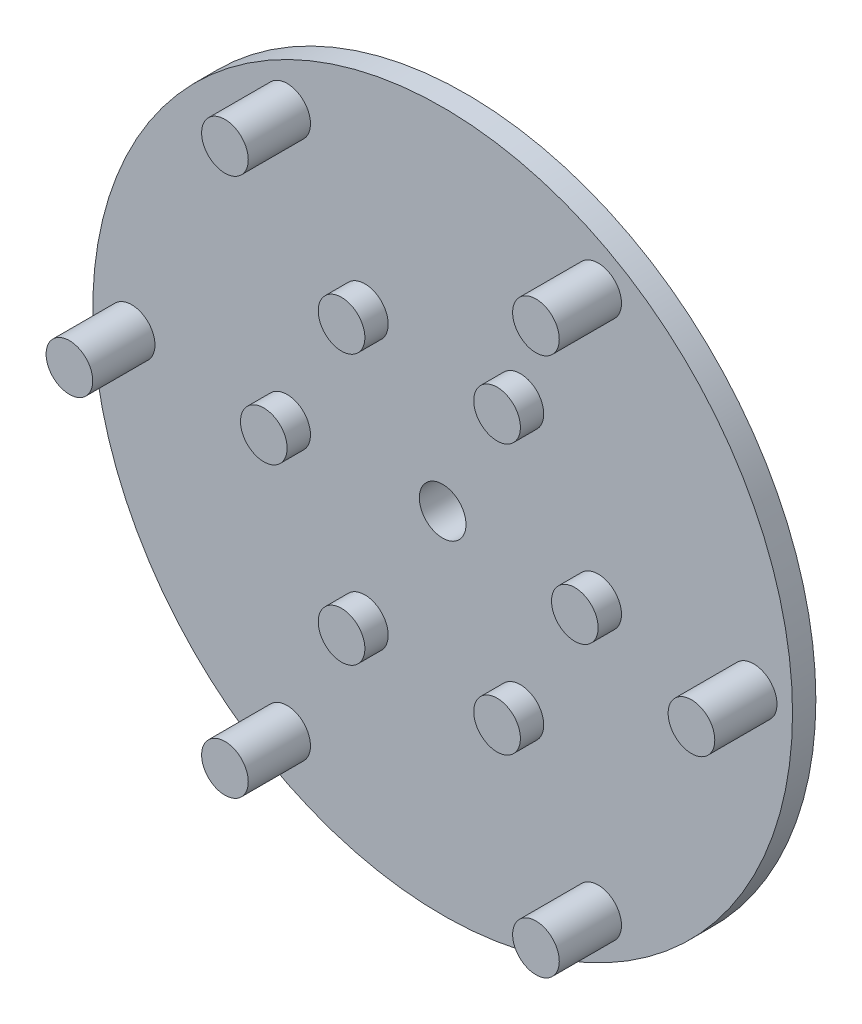
ISO-10303-21;
HEADER;
FILE_DESCRIPTION(('STEP AP214'),'2;1');
FILE_NAME('part.step','',(''),(''),'','','');
FILE_SCHEMA(('AUTOMOTIVE_DESIGN { 1 0 10303 214 1 1 1 1 }'));
ENDSEC;
DATA;
#1=APPLICATION_CONTEXT('core data for automotive mechanical design processes');
#2=APPLICATION_PROTOCOL_DEFINITION('international standard','automotive_design',2000,#1);
#3=PRODUCT_CONTEXT('',#1,'mechanical');
#4=PRODUCT('Part','Part','',(#3));
#5=PRODUCT_RELATED_PRODUCT_CATEGORY('part','',(#4));
#6=PRODUCT_DEFINITION_FORMATION('','',#4);
#7=PRODUCT_DEFINITION_CONTEXT('part definition',#1,'design');
#8=PRODUCT_DEFINITION('design','',#6,#7);
#9=PRODUCT_DEFINITION_SHAPE('','',#8);
#10=(LENGTH_UNIT() NAMED_UNIT(*) SI_UNIT(.MILLI.,.METRE.));
#11=(NAMED_UNIT(*) PLANE_ANGLE_UNIT() SI_UNIT($,.RADIAN.));
#12=(NAMED_UNIT(*) SI_UNIT($,.STERADIAN.) SOLID_ANGLE_UNIT());
#13=UNCERTAINTY_MEASURE_WITH_UNIT(LENGTH_MEASURE(1.E-05),#10,'distance_accuracy_value','');
#14=(GEOMETRIC_REPRESENTATION_CONTEXT(3) GLOBAL_UNCERTAINTY_ASSIGNED_CONTEXT((#13)) GLOBAL_UNIT_ASSIGNED_CONTEXT((#10,
#11,#12)) REPRESENTATION_CONTEXT('',''));
#15=CARTESIAN_POINT('',(0.,0.,0.));
#16=DIRECTION('',(0.,0.,1.));
#17=DIRECTION('',(1.,0.,0.));
#18=AXIS2_PLACEMENT_3D('',#15,#16,#17);
#19=CARTESIAN_POINT('',(0.,0.,-3.));
#20=DIRECTION('',(0.,0.,1.));
#21=DIRECTION('',(1.,0.,0.));
#22=AXIS2_PLACEMENT_3D('',#19,#20,#21);
#23=PLANE('',#22);
#24=CARTESIAN_POINT('',(0.,0.,-3.));
#25=DIRECTION('',(0.,0.,1.));
#26=DIRECTION('',(1.,0.,0.));
#27=AXIS2_PLACEMENT_3D('',#24,#25,#26);
#28=CIRCLE('',#27,45.);
#29=CARTESIAN_POINT('',(45.,0.,-3.));
#30=VERTEX_POINT('',#29);
#31=EDGE_CURVE('E58',#30,#30,#28,.T.);
#32=ORIENTED_EDGE('',*,*,#31,.F.);
#33=EDGE_LOOP('',(#32));
#34=FACE_BOUND('',#33,.T.);
#35=CARTESIAN_POINT('',(0.,0.,-3.));
#36=DIRECTION('',(0.,0.,1.));
#37=DIRECTION('',(1.,0.,0.));
#38=AXIS2_PLACEMENT_3D('',#35,#36,#37);
#39=CIRCLE('',#38,6.);
#40=CARTESIAN_POINT('',(6.,0.,-3.));
#41=VERTEX_POINT('',#40);
#42=EDGE_CURVE('E11',#41,#41,#39,.F.);
#43=ORIENTED_EDGE('',*,*,#42,.F.);
#44=EDGE_LOOP('',(#43));
#45=FACE_BOUND('',#44,.T.);
#46=ADVANCED_FACE('F51',(#34,#45),#23,.F.);
#47=CARTESIAN_POINT('',(0.,0.,-3.));
#48=DIRECTION('',(0.,0.,1.));
#49=DIRECTION('',(1.,0.,0.));
#50=AXIS2_PLACEMENT_3D('',#47,#48,#49);
#51=CYLINDRICAL_SURFACE('',#50,45.);
#52=ORIENTED_EDGE('',*,*,#31,.T.);
#53=EDGE_LOOP('',(#52));
#54=FACE_BOUND('',#53,.T.);
#55=CARTESIAN_POINT('',(0.,0.,0.));
#56=DIRECTION('',(0.,0.,1.));
#57=DIRECTION('',(1.,0.,0.));
#58=AXIS2_PLACEMENT_3D('',#55,#56,#57);
#59=CIRCLE('',#58,45.);
#60=CARTESIAN_POINT('',(45.,0.,0.));
#61=VERTEX_POINT('',#60);
#62=EDGE_CURVE('E62',#61,#61,#59,.T.);
#63=ORIENTED_EDGE('',*,*,#62,.F.);
#64=EDGE_LOOP('',(#63));
#65=FACE_BOUND('',#64,.T.);
#66=ADVANCED_FACE('F53',(#54,#65),#51,.T.);
#67=CARTESIAN_POINT('',(0.,0.,0.));
#68=DIRECTION('',(0.,0.,1.));
#69=DIRECTION('',(1.,0.,0.));
#70=AXIS2_PLACEMENT_3D('',#67,#68,#69);
#71=PLANE('',#70);
#72=CARTESIAN_POINT('',(0.,0.,0.));
#73=DIRECTION('',(0.,0.,1.));
#74=DIRECTION('',(1.,0.,0.));
#75=AXIS2_PLACEMENT_3D('',#72,#73,#74);
#76=CIRCLE('',#75,3.);
#77=CARTESIAN_POINT('',(3.,0.,0.));
#78=VERTEX_POINT('',#77);
#79=EDGE_CURVE('E138',#78,#78,#76,.T.);
#80=ORIENTED_EDGE('',*,*,#79,.F.);
#81=EDGE_LOOP('',(#80));
#82=FACE_BOUND('',#81,.T.);
#83=CARTESIAN_POINT('',(-20.,0.,0.));
#84=DIRECTION('',(0.,0.,1.));
#85=DIRECTION('',(1.,0.,0.));
#86=AXIS2_PLACEMENT_3D('',#83,#84,#85);
#87=CIRCLE('',#86,3.);
#88=CARTESIAN_POINT('',(-17.,0.,0.));
#89=VERTEX_POINT('',#88);
#90=EDGE_CURVE('E132',#89,#89,#87,.T.);
#91=ORIENTED_EDGE('',*,*,#90,.F.);
#92=EDGE_LOOP('',(#91));
#93=FACE_BOUND('',#92,.T.);
#94=CARTESIAN_POINT('',(-9.99999999999999,-17.3205080756888,0.));
#95=DIRECTION('',(0.,0.,1.));
#96=DIRECTION('',(1.,0.,0.));
#97=AXIS2_PLACEMENT_3D('',#94,#95,#96);
#98=CIRCLE('',#97,3.);
#99=CARTESIAN_POINT('',(-6.99999999999999,-17.3205080756888,0.));
#100=VERTEX_POINT('',#99);
#101=EDGE_CURVE('E126',#100,#100,#98,.T.);
#102=ORIENTED_EDGE('',*,*,#101,.F.);
#103=EDGE_LOOP('',(#102));
#104=FACE_BOUND('',#103,.T.);
#105=CARTESIAN_POINT('',(10.,-17.3205080756888,0.));
#106=DIRECTION('',(0.,0.,1.));
#107=DIRECTION('',(1.,0.,0.));
#108=AXIS2_PLACEMENT_3D('',#105,#106,#107);
#109=CIRCLE('',#108,3.);
#110=CARTESIAN_POINT('',(13.,-17.3205080756888,0.));
#111=VERTEX_POINT('',#110);
#112=EDGE_CURVE('E120',#111,#111,#109,.T.);
#113=ORIENTED_EDGE('',*,*,#112,.F.);
#114=EDGE_LOOP('',(#113));
#115=FACE_BOUND('',#114,.T.);
#116=CARTESIAN_POINT('',(20.,0.,0.));
#117=DIRECTION('',(0.,0.,1.));
#118=DIRECTION('',(1.,0.,0.));
#119=AXIS2_PLACEMENT_3D('',#116,#117,#118);
#120=CIRCLE('',#119,3.);
#121=CARTESIAN_POINT('',(23.,0.,0.));
#122=VERTEX_POINT('',#121);
#123=EDGE_CURVE('E114',#122,#122,#120,.T.);
#124=ORIENTED_EDGE('',*,*,#123,.F.);
#125=EDGE_LOOP('',(#124));
#126=FACE_BOUND('',#125,.T.);
#127=CARTESIAN_POINT('',(9.99999999999999,17.3205080756888,0.));
#128=DIRECTION('',(0.,0.,1.));
#129=DIRECTION('',(1.,0.,0.));
#130=AXIS2_PLACEMENT_3D('',#127,#128,#129);
#131=CIRCLE('',#130,3.);
#132=CARTESIAN_POINT('',(13.,17.3205080756888,0.));
#133=VERTEX_POINT('',#132);
#134=EDGE_CURVE('E108',#133,#133,#131,.T.);
#135=ORIENTED_EDGE('',*,*,#134,.F.);
#136=EDGE_LOOP('',(#135));
#137=FACE_BOUND('',#136,.T.);
#138=CARTESIAN_POINT('',(-10.,17.3205080756888,0.));
#139=DIRECTION('',(0.,0.,1.));
#140=DIRECTION('',(1.,0.,0.));
#141=AXIS2_PLACEMENT_3D('',#138,#139,#140);
#142=CIRCLE('',#141,3.);
#143=CARTESIAN_POINT('',(-7.,17.3205080756888,0.));
#144=VERTEX_POINT('',#143);
#145=EDGE_CURVE('E105',#144,#144,#142,.T.);
#146=ORIENTED_EDGE('',*,*,#145,.F.);
#147=EDGE_LOOP('',(#146));
#148=FACE_BOUND('',#147,.T.);
#149=CARTESIAN_POINT('',(-20.,-34.6410161513775,0.));
#150=DIRECTION('',(0.,0.,1.));
#151=DIRECTION('',(1.,0.,0.));
#152=AXIS2_PLACEMENT_3D('',#149,#150,#151);
#153=CIRCLE('',#152,3.);
#154=CARTESIAN_POINT('',(-17.,-34.6410161513775,0.));
#155=VERTEX_POINT('',#154);
#156=EDGE_CURVE('E99',#155,#155,#153,.T.);
#157=ORIENTED_EDGE('',*,*,#156,.F.);
#158=EDGE_LOOP('',(#157));
#159=FACE_BOUND('',#158,.T.);
#160=CARTESIAN_POINT('',(20.,-34.6410161513775,0.));
#161=DIRECTION('',(0.,0.,1.));
#162=DIRECTION('',(1.,0.,0.));
#163=AXIS2_PLACEMENT_3D('',#160,#161,#162);
#164=CIRCLE('',#163,3.);
#165=CARTESIAN_POINT('',(23.,-34.6410161513775,0.));
#166=VERTEX_POINT('',#165);
#167=EDGE_CURVE('E93',#166,#166,#164,.T.);
#168=ORIENTED_EDGE('',*,*,#167,.F.);
#169=EDGE_LOOP('',(#168));
#170=FACE_BOUND('',#169,.T.);
#171=CARTESIAN_POINT('',(40.,0.,0.));
#172=DIRECTION('',(0.,0.,1.));
#173=DIRECTION('',(1.,0.,0.));
#174=AXIS2_PLACEMENT_3D('',#171,#172,#173);
#175=CIRCLE('',#174,3.);
#176=CARTESIAN_POINT('',(43.,0.,0.));
#177=VERTEX_POINT('',#176);
#178=EDGE_CURVE('E87',#177,#177,#175,.T.);
#179=ORIENTED_EDGE('',*,*,#178,.F.);
#180=EDGE_LOOP('',(#179));
#181=FACE_BOUND('',#180,.T.);
#182=CARTESIAN_POINT('',(20.,34.6410161513776,0.));
#183=DIRECTION('',(0.,0.,1.));
#184=DIRECTION('',(1.,0.,0.));
#185=AXIS2_PLACEMENT_3D('',#182,#183,#184);
#186=CIRCLE('',#185,3.);
#187=CARTESIAN_POINT('',(23.,34.6410161513776,0.));
#188=VERTEX_POINT('',#187);
#189=EDGE_CURVE('E81',#188,#188,#186,.T.);
#190=ORIENTED_EDGE('',*,*,#189,.F.);
#191=EDGE_LOOP('',(#190));
#192=FACE_BOUND('',#191,.T.);
#193=CARTESIAN_POINT('',(-20.,34.6410161513775,0.));
#194=DIRECTION('',(0.,0.,1.));
#195=DIRECTION('',(1.,0.,0.));
#196=AXIS2_PLACEMENT_3D('',#193,#194,#195);
#197=CIRCLE('',#196,3.);
#198=CARTESIAN_POINT('',(-17.,34.6410161513775,0.));
#199=VERTEX_POINT('',#198);
#200=EDGE_CURVE('E75',#199,#199,#197,.T.);
#201=ORIENTED_EDGE('',*,*,#200,.F.);
#202=EDGE_LOOP('',(#201));
#203=FACE_BOUND('',#202,.T.);
#204=CARTESIAN_POINT('',(-40.,0.,0.));
#205=DIRECTION('',(0.,0.,1.));
#206=DIRECTION('',(1.,0.,0.));
#207=AXIS2_PLACEMENT_3D('',#204,#205,#206);
#208=CIRCLE('',#207,3.);
#209=CARTESIAN_POINT('',(-37.,0.,0.));
#210=VERTEX_POINT('',#209);
#211=EDGE_CURVE('E69',#210,#210,#208,.T.);
#212=ORIENTED_EDGE('',*,*,#211,.F.);
#213=EDGE_LOOP('',(#212));
#214=FACE_BOUND('',#213,.T.);
#215=ORIENTED_EDGE('',*,*,#62,.T.);
#216=EDGE_LOOP('',(#215));
#217=FACE_BOUND('',#216,.T.);
#218=ADVANCED_FACE('F173',(#82,#93,#104,#115,#126,#137,#148,#159,#170,#181,#192,#203,#214,#217),
#71,.T.);
#219=CARTESIAN_POINT('',(-40.,0.,8.));
#220=DIRECTION('',(0.,0.,-1.));
#221=DIRECTION('',(-1.,0.,0.));
#222=AXIS2_PLACEMENT_3D('',#219,#220,#221);
#223=CYLINDRICAL_SURFACE('',#222,3.);
#224=CARTESIAN_POINT('',(-40.,0.,8.));
#225=DIRECTION('',(0.,0.,1.));
#226=DIRECTION('',(1.,0.,0.));
#227=AXIS2_PLACEMENT_3D('',#224,#225,#226);
#228=CIRCLE('',#227,3.);
#229=CARTESIAN_POINT('',(-37.,0.,8.));
#230=VERTEX_POINT('',#229);
#231=EDGE_CURVE('E67',#230,#230,#228,.T.);
#232=ORIENTED_EDGE('',*,*,#231,.F.);
#233=EDGE_LOOP('',(#232));
#234=FACE_BOUND('',#233,.T.);
#235=ORIENTED_EDGE('',*,*,#211,.T.);
#236=EDGE_LOOP('',(#235));
#237=FACE_BOUND('',#236,.T.);
#238=ADVANCED_FACE('F176',(#234,#237),#223,.T.);
#239=CARTESIAN_POINT('',(0.,0.,8.));
#240=DIRECTION('',(0.,0.,1.));
#241=DIRECTION('',(1.,0.,0.));
#242=AXIS2_PLACEMENT_3D('',#239,#240,#241);
#243=PLANE('',#242);
#244=ORIENTED_EDGE('',*,*,#231,.T.);
#245=EDGE_LOOP('',(#244));
#246=FACE_BOUND('',#245,.T.);
#247=ADVANCED_FACE('F183',(#246),#243,.T.);
#248=CARTESIAN_POINT('',(-20.,34.6410161513775,8.));
#249=DIRECTION('',(0.,0.,-1.));
#250=DIRECTION('',(-1.,0.,0.));
#251=AXIS2_PLACEMENT_3D('',#248,#249,#250);
#252=CYLINDRICAL_SURFACE('',#251,3.);
#253=CARTESIAN_POINT('',(-20.,34.6410161513775,8.));
#254=DIRECTION('',(0.,0.,1.));
#255=DIRECTION('',(1.,0.,0.));
#256=AXIS2_PLACEMENT_3D('',#253,#254,#255);
#257=CIRCLE('',#256,3.);
#258=CARTESIAN_POINT('',(-17.,34.6410161513775,8.));
#259=VERTEX_POINT('',#258);
#260=EDGE_CURVE('E72',#259,#259,#257,.T.);
#261=ORIENTED_EDGE('',*,*,#260,.F.);
#262=EDGE_LOOP('',(#261));
#263=FACE_BOUND('',#262,.T.);
#264=ORIENTED_EDGE('',*,*,#200,.T.);
#265=EDGE_LOOP('',(#264));
#266=FACE_BOUND('',#265,.T.);
#267=ADVANCED_FACE('F215',(#263,#266),#252,.T.);
#268=CARTESIAN_POINT('',(0.,0.,8.));
#269=DIRECTION('',(0.,0.,1.));
#270=DIRECTION('',(1.,0.,0.));
#271=AXIS2_PLACEMENT_3D('',#268,#269,#270);
#272=PLANE('',#271);
#273=ORIENTED_EDGE('',*,*,#260,.T.);
#274=EDGE_LOOP('',(#273));
#275=FACE_BOUND('',#274,.T.);
#276=ADVANCED_FACE('F217',(#275),#272,.T.);
#277=CARTESIAN_POINT('',(20.,34.6410161513776,8.));
#278=DIRECTION('',(0.,0.,-1.));
#279=DIRECTION('',(-1.,0.,0.));
#280=AXIS2_PLACEMENT_3D('',#277,#278,#279);
#281=CYLINDRICAL_SURFACE('',#280,3.);
#282=CARTESIAN_POINT('',(20.,34.6410161513776,8.));
#283=DIRECTION('',(0.,0.,1.));
#284=DIRECTION('',(1.,0.,0.));
#285=AXIS2_PLACEMENT_3D('',#282,#283,#284);
#286=CIRCLE('',#285,3.);
#287=CARTESIAN_POINT('',(23.,34.6410161513776,8.));
#288=VERTEX_POINT('',#287);
#289=EDGE_CURVE('E78',#288,#288,#286,.T.);
#290=ORIENTED_EDGE('',*,*,#289,.F.);
#291=EDGE_LOOP('',(#290));
#292=FACE_BOUND('',#291,.T.);
#293=ORIENTED_EDGE('',*,*,#189,.T.);
#294=EDGE_LOOP('',(#293));
#295=FACE_BOUND('',#294,.T.);
#296=ADVANCED_FACE('F224',(#292,#295),#281,.T.);
#297=CARTESIAN_POINT('',(0.,0.,8.));
#298=DIRECTION('',(0.,0.,1.));
#299=DIRECTION('',(1.,0.,0.));
#300=AXIS2_PLACEMENT_3D('',#297,#298,#299);
#301=PLANE('',#300);
#302=ORIENTED_EDGE('',*,*,#289,.T.);
#303=EDGE_LOOP('',(#302));
#304=FACE_BOUND('',#303,.T.);
#305=ADVANCED_FACE('F232',(#304),#301,.T.);
#306=CARTESIAN_POINT('',(40.,0.,8.));
#307=DIRECTION('',(0.,0.,-1.));
#308=DIRECTION('',(-1.,0.,0.));
#309=AXIS2_PLACEMENT_3D('',#306,#307,#308);
#310=CYLINDRICAL_SURFACE('',#309,3.);
#311=CARTESIAN_POINT('',(40.,0.,8.));
#312=DIRECTION('',(0.,0.,1.));
#313=DIRECTION('',(1.,0.,0.));
#314=AXIS2_PLACEMENT_3D('',#311,#312,#313);
#315=CIRCLE('',#314,3.);
#316=CARTESIAN_POINT('',(43.,0.,8.));
#317=VERTEX_POINT('',#316);
#318=EDGE_CURVE('E84',#317,#317,#315,.T.);
#319=ORIENTED_EDGE('',*,*,#318,.F.);
#320=EDGE_LOOP('',(#319));
#321=FACE_BOUND('',#320,.T.);
#322=ORIENTED_EDGE('',*,*,#178,.T.);
#323=EDGE_LOOP('',(#322));
#324=FACE_BOUND('',#323,.T.);
#325=ADVANCED_FACE('F236',(#321,#324),#310,.T.);
#326=CARTESIAN_POINT('',(0.,0.,8.));
#327=DIRECTION('',(0.,0.,1.));
#328=DIRECTION('',(1.,0.,0.));
#329=AXIS2_PLACEMENT_3D('',#326,#327,#328);
#330=PLANE('',#329);
#331=ORIENTED_EDGE('',*,*,#318,.T.);
#332=EDGE_LOOP('',(#331));
#333=FACE_BOUND('',#332,.T.);
#334=ADVANCED_FACE('F240',(#333),#330,.T.);
#335=CARTESIAN_POINT('',(20.,-34.6410161513775,8.));
#336=DIRECTION('',(0.,0.,-1.));
#337=DIRECTION('',(-1.,0.,0.));
#338=AXIS2_PLACEMENT_3D('',#335,#336,#337);
#339=CYLINDRICAL_SURFACE('',#338,3.);
#340=CARTESIAN_POINT('',(20.,-34.6410161513775,8.));
#341=DIRECTION('',(0.,0.,1.));
#342=DIRECTION('',(1.,0.,0.));
#343=AXIS2_PLACEMENT_3D('',#340,#341,#342);
#344=CIRCLE('',#343,3.);
#345=CARTESIAN_POINT('',(23.,-34.6410161513775,8.));
#346=VERTEX_POINT('',#345);
#347=EDGE_CURVE('E90',#346,#346,#344,.T.);
#348=ORIENTED_EDGE('',*,*,#347,.F.);
#349=EDGE_LOOP('',(#348));
#350=FACE_BOUND('',#349,.T.);
#351=ORIENTED_EDGE('',*,*,#167,.T.);
#352=EDGE_LOOP('',(#351));
#353=FACE_BOUND('',#352,.T.);
#354=ADVANCED_FACE('F244',(#350,#353),#339,.T.);
#355=CARTESIAN_POINT('',(0.,0.,8.));
#356=DIRECTION('',(0.,0.,1.));
#357=DIRECTION('',(1.,0.,0.));
#358=AXIS2_PLACEMENT_3D('',#355,#356,#357);
#359=PLANE('',#358);
#360=ORIENTED_EDGE('',*,*,#347,.T.);
#361=EDGE_LOOP('',(#360));
#362=FACE_BOUND('',#361,.T.);
#363=ADVANCED_FACE('F248',(#362),#359,.T.);
#364=CARTESIAN_POINT('',(-20.,-34.6410161513775,8.));
#365=DIRECTION('',(0.,0.,-1.));
#366=DIRECTION('',(-1.,0.,0.));
#367=AXIS2_PLACEMENT_3D('',#364,#365,#366);
#368=CYLINDRICAL_SURFACE('',#367,3.);
#369=CARTESIAN_POINT('',(-20.,-34.6410161513775,8.));
#370=DIRECTION('',(0.,0.,1.));
#371=DIRECTION('',(1.,0.,0.));
#372=AXIS2_PLACEMENT_3D('',#369,#370,#371);
#373=CIRCLE('',#372,3.);
#374=CARTESIAN_POINT('',(-17.,-34.6410161513775,8.));
#375=VERTEX_POINT('',#374);
#376=EDGE_CURVE('E96',#375,#375,#373,.T.);
#377=ORIENTED_EDGE('',*,*,#376,.F.);
#378=EDGE_LOOP('',(#377));
#379=FACE_BOUND('',#378,.T.);
#380=ORIENTED_EDGE('',*,*,#156,.T.);
#381=EDGE_LOOP('',(#380));
#382=FACE_BOUND('',#381,.T.);
#383=ADVANCED_FACE('F252',(#379,#382),#368,.T.);
#384=CARTESIAN_POINT('',(0.,0.,8.));
#385=DIRECTION('',(0.,0.,1.));
#386=DIRECTION('',(1.,0.,0.));
#387=AXIS2_PLACEMENT_3D('',#384,#385,#386);
#388=PLANE('',#387);
#389=ORIENTED_EDGE('',*,*,#376,.T.);
#390=EDGE_LOOP('',(#389));
#391=FACE_BOUND('',#390,.T.);
#392=ADVANCED_FACE('F256',(#391),#388,.T.);
#393=CARTESIAN_POINT('',(-10.,17.3205080756888,3.));
#394=DIRECTION('',(0.,0.,-1.));
#395=DIRECTION('',(-1.,0.,0.));
#396=AXIS2_PLACEMENT_3D('',#393,#394,#395);
#397=CYLINDRICAL_SURFACE('',#396,3.);
#398=CARTESIAN_POINT('',(-10.,17.3205080756888,3.));
#399=DIRECTION('',(0.,0.,1.));
#400=DIRECTION('',(1.,0.,0.));
#401=AXIS2_PLACEMENT_3D('',#398,#399,#400);
#402=CIRCLE('',#401,3.);
#403=CARTESIAN_POINT('',(-7.,17.3205080756888,3.));
#404=VERTEX_POINT('',#403);
#405=EDGE_CURVE('E102',#404,#404,#402,.T.);
#406=ORIENTED_EDGE('',*,*,#405,.F.);
#407=EDGE_LOOP('',(#406));
#408=FACE_BOUND('',#407,.T.);
#409=ORIENTED_EDGE('',*,*,#145,.T.);
#410=EDGE_LOOP('',(#409));
#411=FACE_BOUND('',#410,.T.);
#412=ADVANCED_FACE('F260',(#408,#411),#397,.T.);
#413=CARTESIAN_POINT('',(-10.,17.3205080756888,3.));
#414=DIRECTION('',(0.,0.,1.));
#415=DIRECTION('',(1.,0.,0.));
#416=AXIS2_PLACEMENT_3D('',#413,#414,#415);
#417=PLANE('',#416);
#418=ORIENTED_EDGE('',*,*,#405,.T.);
#419=EDGE_LOOP('',(#418));
#420=FACE_BOUND('',#419,.T.);
#421=ADVANCED_FACE('F264',(#420),#417,.T.);
#422=CARTESIAN_POINT('',(9.99999999999999,17.3205080756888,3.));
#423=DIRECTION('',(0.,0.,-1.));
#424=DIRECTION('',(-1.,0.,0.));
#425=AXIS2_PLACEMENT_3D('',#422,#423,#424);
#426=CYLINDRICAL_SURFACE('',#425,3.);
#427=CARTESIAN_POINT('',(9.99999999999999,17.3205080756888,3.));
#428=DIRECTION('',(0.,0.,1.));
#429=DIRECTION('',(1.,0.,0.));
#430=AXIS2_PLACEMENT_3D('',#427,#428,#429);
#431=CIRCLE('',#430,3.);
#432=CARTESIAN_POINT('',(13.,17.3205080756888,3.));
#433=VERTEX_POINT('',#432);
#434=EDGE_CURVE('E111',#433,#433,#431,.T.);
#435=ORIENTED_EDGE('',*,*,#434,.F.);
#436=EDGE_LOOP('',(#435));
#437=FACE_BOUND('',#436,.T.);
#438=ORIENTED_EDGE('',*,*,#134,.T.);
#439=EDGE_LOOP('',(#438));
#440=FACE_BOUND('',#439,.T.);
#441=ADVANCED_FACE('F268',(#437,#440),#426,.T.);
#442=CARTESIAN_POINT('',(9.99999999999999,17.3205080756888,3.));
#443=DIRECTION('',(0.,0.,1.));
#444=DIRECTION('',(1.,0.,0.));
#445=AXIS2_PLACEMENT_3D('',#442,#443,#444);
#446=PLANE('',#445);
#447=ORIENTED_EDGE('',*,*,#434,.T.);
#448=EDGE_LOOP('',(#447));
#449=FACE_BOUND('',#448,.T.);
#450=ADVANCED_FACE('F270',(#449),#446,.T.);
#451=CARTESIAN_POINT('',(20.,0.,3.));
#452=DIRECTION('',(0.,0.,-1.));
#453=DIRECTION('',(-1.,0.,0.));
#454=AXIS2_PLACEMENT_3D('',#451,#452,#453);
#455=CYLINDRICAL_SURFACE('',#454,3.);
#456=CARTESIAN_POINT('',(20.,0.,3.));
#457=DIRECTION('',(0.,0.,1.));
#458=DIRECTION('',(1.,0.,0.));
#459=AXIS2_PLACEMENT_3D('',#456,#457,#458);
#460=CIRCLE('',#459,3.);
#461=CARTESIAN_POINT('',(23.,0.,3.));
#462=VERTEX_POINT('',#461);
#463=EDGE_CURVE('E117',#462,#462,#460,.T.);
#464=ORIENTED_EDGE('',*,*,#463,.F.);
#465=EDGE_LOOP('',(#464));
#466=FACE_BOUND('',#465,.T.);
#467=ORIENTED_EDGE('',*,*,#123,.T.);
#468=EDGE_LOOP('',(#467));
#469=FACE_BOUND('',#468,.T.);
#470=ADVANCED_FACE('F273',(#466,#469),#455,.T.);
#471=CARTESIAN_POINT('',(20.,0.,3.));
#472=DIRECTION('',(0.,0.,1.));
#473=DIRECTION('',(1.,0.,0.));
#474=AXIS2_PLACEMENT_3D('',#471,#472,#473);
#475=PLANE('',#474);
#476=ORIENTED_EDGE('',*,*,#463,.T.);
#477=EDGE_LOOP('',(#476));
#478=FACE_BOUND('',#477,.T.);
#479=ADVANCED_FACE('F278',(#478),#475,.T.);
#480=CARTESIAN_POINT('',(10.,-17.3205080756888,3.));
#481=DIRECTION('',(0.,0.,-1.));
#482=DIRECTION('',(-1.,0.,0.));
#483=AXIS2_PLACEMENT_3D('',#480,#481,#482);
#484=CYLINDRICAL_SURFACE('',#483,3.);
#485=CARTESIAN_POINT('',(10.,-17.3205080756888,3.));
#486=DIRECTION('',(0.,0.,1.));
#487=DIRECTION('',(1.,0.,0.));
#488=AXIS2_PLACEMENT_3D('',#485,#486,#487);
#489=CIRCLE('',#488,3.);
#490=CARTESIAN_POINT('',(13.,-17.3205080756888,3.));
#491=VERTEX_POINT('',#490);
#492=EDGE_CURVE('E123',#491,#491,#489,.T.);
#493=ORIENTED_EDGE('',*,*,#492,.F.);
#494=EDGE_LOOP('',(#493));
#495=FACE_BOUND('',#494,.T.);
#496=ORIENTED_EDGE('',*,*,#112,.T.);
#497=EDGE_LOOP('',(#496));
#498=FACE_BOUND('',#497,.T.);
#499=ADVANCED_FACE('F281',(#495,#498),#484,.T.);
#500=CARTESIAN_POINT('',(10.,-17.3205080756888,3.));
#501=DIRECTION('',(0.,0.,1.));
#502=DIRECTION('',(1.,0.,0.));
#503=AXIS2_PLACEMENT_3D('',#500,#501,#502);
#504=PLANE('',#503);
#505=ORIENTED_EDGE('',*,*,#492,.T.);
#506=EDGE_LOOP('',(#505));
#507=FACE_BOUND('',#506,.T.);
#508=ADVANCED_FACE('F286',(#507),#504,.T.);
#509=CARTESIAN_POINT('',(-9.99999999999999,-17.3205080756888,3.));
#510=DIRECTION('',(0.,0.,-1.));
#511=DIRECTION('',(-1.,0.,0.));
#512=AXIS2_PLACEMENT_3D('',#509,#510,#511);
#513=CYLINDRICAL_SURFACE('',#512,3.);
#514=CARTESIAN_POINT('',(-9.99999999999999,-17.3205080756888,3.));
#515=DIRECTION('',(0.,0.,1.));
#516=DIRECTION('',(1.,0.,0.));
#517=AXIS2_PLACEMENT_3D('',#514,#515,#516);
#518=CIRCLE('',#517,3.);
#519=CARTESIAN_POINT('',(-6.99999999999999,-17.3205080756888,3.));
#520=VERTEX_POINT('',#519);
#521=EDGE_CURVE('E129',#520,#520,#518,.T.);
#522=ORIENTED_EDGE('',*,*,#521,.F.);
#523=EDGE_LOOP('',(#522));
#524=FACE_BOUND('',#523,.T.);
#525=ORIENTED_EDGE('',*,*,#101,.T.);
#526=EDGE_LOOP('',(#525));
#527=FACE_BOUND('',#526,.T.);
#528=ADVANCED_FACE('F289',(#524,#527),#513,.T.);
#529=CARTESIAN_POINT('',(-9.99999999999999,-17.3205080756888,3.));
#530=DIRECTION('',(0.,0.,1.));
#531=DIRECTION('',(1.,0.,0.));
#532=AXIS2_PLACEMENT_3D('',#529,#530,#531);
#533=PLANE('',#532);
#534=ORIENTED_EDGE('',*,*,#521,.T.);
#535=EDGE_LOOP('',(#534));
#536=FACE_BOUND('',#535,.T.);
#537=ADVANCED_FACE('F294',(#536),#533,.T.);
#538=CARTESIAN_POINT('',(-20.,0.,3.));
#539=DIRECTION('',(0.,0.,-1.));
#540=DIRECTION('',(-1.,0.,0.));
#541=AXIS2_PLACEMENT_3D('',#538,#539,#540);
#542=CYLINDRICAL_SURFACE('',#541,3.);
#543=CARTESIAN_POINT('',(-20.,0.,3.));
#544=DIRECTION('',(0.,0.,1.));
#545=DIRECTION('',(1.,0.,0.));
#546=AXIS2_PLACEMENT_3D('',#543,#544,#545);
#547=CIRCLE('',#546,3.);
#548=CARTESIAN_POINT('',(-17.,0.,3.));
#549=VERTEX_POINT('',#548);
#550=EDGE_CURVE('E135',#549,#549,#547,.T.);
#551=ORIENTED_EDGE('',*,*,#550,.F.);
#552=EDGE_LOOP('',(#551));
#553=FACE_BOUND('',#552,.T.);
#554=ORIENTED_EDGE('',*,*,#90,.T.);
#555=EDGE_LOOP('',(#554));
#556=FACE_BOUND('',#555,.T.);
#557=ADVANCED_FACE('F297',(#553,#556),#542,.T.);
#558=CARTESIAN_POINT('',(-20.,0.,3.));
#559=DIRECTION('',(0.,0.,1.));
#560=DIRECTION('',(1.,0.,0.));
#561=AXIS2_PLACEMENT_3D('',#558,#559,#560);
#562=PLANE('',#561);
#563=ORIENTED_EDGE('',*,*,#550,.T.);
#564=EDGE_LOOP('',(#563));
#565=FACE_BOUND('',#564,.T.);
#566=ADVANCED_FACE('F163',(#565),#562,.T.);
#567=CARTESIAN_POINT('',(0.,0.,-3.001));
#568=DIRECTION('',(0.,0.,1.));
#569=DIRECTION('',(1.,0.,0.));
#570=AXIS2_PLACEMENT_3D('',#567,#568,#569);
#571=CYLINDRICAL_SURFACE('',#570,3.);
#572=CARTESIAN_POINT('',(0.,0.,-9.));
#573=DIRECTION('',(0.,0.,-1.));
#574=DIRECTION('',(-1.,0.,0.));
#575=AXIS2_PLACEMENT_3D('',#572,#573,#574);
#576=CIRCLE('',#575,3.);
#577=CARTESIAN_POINT('',(3.,0.,-9.));
#578=VERTEX_POINT('',#577);
#579=EDGE_CURVE('E146',#578,#578,#576,.T.);
#580=CARTESIAN_POINT('',(3.,0.,0.));
#581=CARTESIAN_POINT('',(3.,0.,-0.0937500000000007));
#582=CARTESIAN_POINT('',(3.,0.,-0.187500000000001));
#583=CARTESIAN_POINT('',(3.,0.,-0.375000000000001));
#584=CARTESIAN_POINT('',(3.,0.,-0.468750000000001));
#585=CARTESIAN_POINT('',(3.,0.,-0.65625));
#586=CARTESIAN_POINT('',(3.,0.,-0.75));
#587=CARTESIAN_POINT('',(3.,0.,-0.9375));
#588=CARTESIAN_POINT('',(3.,0.,-1.03125));
#589=CARTESIAN_POINT('',(3.,0.,-1.21875));
#590=CARTESIAN_POINT('',(3.,0.,-1.3125));
#591=CARTESIAN_POINT('',(3.,0.,-1.5));
#592=CARTESIAN_POINT('',(3.,0.,-1.59375));
#593=CARTESIAN_POINT('',(3.,0.,-1.78125));
#594=CARTESIAN_POINT('',(3.,0.,-1.875));
#595=CARTESIAN_POINT('',(3.,0.,-2.0625));
#596=CARTESIAN_POINT('',(3.,0.,-2.15625));
#597=CARTESIAN_POINT('',(3.,0.,-2.34375));
#598=CARTESIAN_POINT('',(3.,0.,-2.4375));
#599=CARTESIAN_POINT('',(3.,0.,-2.625));
#600=CARTESIAN_POINT('',(3.,0.,-2.71875));
#601=CARTESIAN_POINT('',(3.,0.,-2.90625));
#602=CARTESIAN_POINT('',(3.,0.,-3.));
#603=CARTESIAN_POINT('',(3.,0.,-3.1875));
#604=CARTESIAN_POINT('',(3.,0.,-3.28125));
#605=CARTESIAN_POINT('',(3.,0.,-3.46875));
#606=CARTESIAN_POINT('',(3.,0.,-3.5625));
#607=CARTESIAN_POINT('',(3.,0.,-3.75));
#608=CARTESIAN_POINT('',(3.,0.,-3.84375));
#609=CARTESIAN_POINT('',(3.,0.,-4.03125));
#610=CARTESIAN_POINT('',(3.,0.,-4.125));
#611=CARTESIAN_POINT('',(3.,0.,-4.3125));
#612=CARTESIAN_POINT('',(3.,0.,-4.40625));
#613=CARTESIAN_POINT('',(3.,0.,-4.59375));
#614=CARTESIAN_POINT('',(3.,0.,-4.6875));
#615=CARTESIAN_POINT('',(3.,0.,-4.875));
#616=CARTESIAN_POINT('',(3.,0.,-4.96875));
#617=CARTESIAN_POINT('',(3.,0.,-5.15625));
#618=CARTESIAN_POINT('',(3.,0.,-5.25));
#619=CARTESIAN_POINT('',(3.,0.,-5.4375));
#620=CARTESIAN_POINT('',(3.,0.,-5.53125));
#621=CARTESIAN_POINT('',(3.,0.,-5.71875));
#622=CARTESIAN_POINT('',(3.,0.,-5.8125));
#623=CARTESIAN_POINT('',(3.,0.,-6.));
#624=CARTESIAN_POINT('',(3.,0.,-6.09375));
#625=CARTESIAN_POINT('',(3.,0.,-6.28125));
#626=CARTESIAN_POINT('',(3.,0.,-6.375));
#627=CARTESIAN_POINT('',(3.,0.,-6.5625));
#628=CARTESIAN_POINT('',(3.,0.,-6.65625));
#629=CARTESIAN_POINT('',(3.,0.,-6.84375));
#630=CARTESIAN_POINT('',(3.,0.,-6.9375));
#631=CARTESIAN_POINT('',(3.,0.,-7.125));
#632=CARTESIAN_POINT('',(3.,0.,-7.21875));
#633=CARTESIAN_POINT('',(3.,0.,-7.40625));
#634=CARTESIAN_POINT('',(3.,0.,-7.5));
#635=CARTESIAN_POINT('',(3.,0.,-7.6875));
#636=CARTESIAN_POINT('',(3.,0.,-7.78125));
#637=CARTESIAN_POINT('',(3.,0.,-7.96875));
#638=CARTESIAN_POINT('',(3.,0.,-8.0625));
#639=CARTESIAN_POINT('',(3.,0.,-8.25));
#640=CARTESIAN_POINT('',(3.,0.,-8.34375));
#641=CARTESIAN_POINT('',(3.,0.,-8.53125));
#642=CARTESIAN_POINT('',(3.,0.,-8.625));
#643=CARTESIAN_POINT('',(3.,0.,-8.8125));
#644=CARTESIAN_POINT('',(3.,0.,-8.90625));
#645=CARTESIAN_POINT('',(3.,0.,-9.));
#646=B_SPLINE_CURVE_WITH_KNOTS('',3,(#580,#581,#582,#583,#584,#585,#586,#587,#588,#589,#590,
#591,#592,#593,#594,#595,#596,#597,#598,#599,#600,#601,#602,#603,#604,#605,#606,#607,#608,#609,
#610,#611,#612,#613,#614,#615,#616,#617,#618,#619,#620,#621,#622,#623,#624,#625,#626,#627,#628,
#629,#630,#631,#632,#633,#634,#635,#636,#637,#638,#639,#640,#641,#642,#643,#644,#645),
.UNSPECIFIED.,.F.,.F.,(4,2,2,2,2,2,2,2,2,2,2,2,2,2,2,2,2,2,2,2,2,2,2,2,2,2,2,2,2,2,2,2,4),(0.,
0.28125,0.5625,0.84375,1.125,1.40625,1.6875,1.96875,2.25,2.53125,2.8125,3.09375,3.375,3.65625,
3.9375,4.21875,4.5,4.78125,5.0625,5.34375,5.625,5.90625,6.1875,6.46875,6.75,7.03125,7.3125,
7.59375,7.875,8.15625,8.4375,8.71875,9.),.UNSPECIFIED.);
#647=EDGE_CURVE('BSEAM150',#78,#578,#646,.T.);
#648=ORIENTED_EDGE('',*,*,#79,.T.);
#649=ORIENTED_EDGE('',*,*,#579,.T.);
#650=ORIENTED_EDGE('',*,*,#647,.T.);
#651=ORIENTED_EDGE('',*,*,#647,.F.);
#652=EDGE_LOOP('',(#648,#650,#649,#651));
#653=FACE_BOUND('',#652,.T.);
#654=ADVANCED_FACE('F150',(#653),#571,.F.);
#655=CARTESIAN_POINT('',(0.,0.,-9.));
#656=DIRECTION('',(0.,0.,-1.));
#657=DIRECTION('',(-1.,0.,0.));
#658=AXIS2_PLACEMENT_3D('',#655,#656,#657);
#659=PLANE('',#658);
#660=CARTESIAN_POINT('',(0.,0.,-9.));
#661=DIRECTION('',(0.,0.,-1.));
#662=DIRECTION('',(-1.,0.,0.));
#663=AXIS2_PLACEMENT_3D('',#660,#661,#662);
#664=CIRCLE('',#663,6.);
#665=CARTESIAN_POINT('',(-6.,0.,-9.));
#666=VERTEX_POINT('',#665);
#667=EDGE_CURVE('E143',#666,#666,#664,.T.);
#668=ORIENTED_EDGE('',*,*,#667,.T.);
#669=EDGE_LOOP('',(#668));
#670=FACE_BOUND('',#669,.T.);
#671=ORIENTED_EDGE('',*,*,#579,.F.);
#672=EDGE_LOOP('',(#671));
#673=FACE_BOUND('',#672,.T.);
#674=ADVANCED_FACE('F152',(#670,#673),#659,.T.);
#675=CARTESIAN_POINT('',(0.,0.,-9.));
#676=DIRECTION('',(0.,0.,1.));
#677=DIRECTION('',(1.,0.,0.));
#678=AXIS2_PLACEMENT_3D('',#675,#676,#677);
#679=CYLINDRICAL_SURFACE('',#678,6.);
#680=ORIENTED_EDGE('',*,*,#667,.F.);
#681=EDGE_LOOP('',(#680));
#682=FACE_BOUND('',#681,.T.);
#683=ORIENTED_EDGE('',*,*,#42,.T.);
#684=EDGE_LOOP('',(#683));
#685=FACE_BOUND('',#684,.T.);
#686=ADVANCED_FACE('F154',(#682,#685),#679,.T.);
#687=CLOSED_SHELL('',(#46,#66,#218,#238,#247,#267,#276,#296,#305,#325,#334,#354,#363,#383,#392,
#412,#421,#441,#450,#470,#479,#499,#508,#528,#537,#557,#566,#654,#674,#686));
#688=MANIFOLD_SOLID_BREP('B2',#687);
#689=ADVANCED_BREP_SHAPE_REPRESENTATION('',(#18,#688),#14);
#690=SHAPE_DEFINITION_REPRESENTATION(#9,#689);
ENDSEC;
END-ISO-10303-21;
